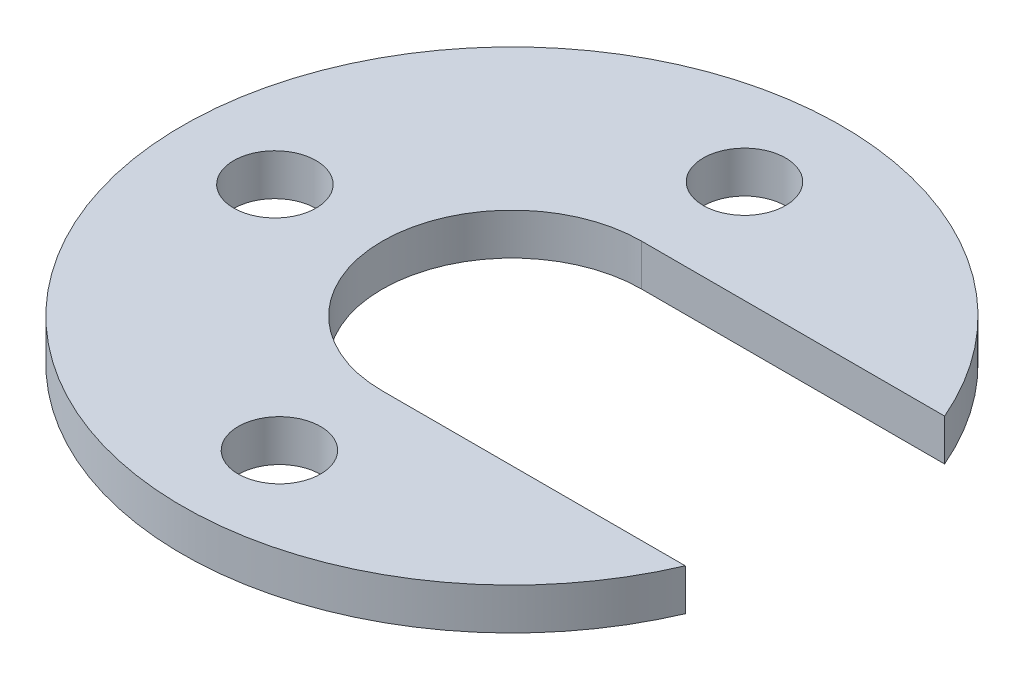
ISO-10303-21;
HEADER;
FILE_DESCRIPTION(('STEP AP214'),'2;1');
FILE_NAME('part.step','',(''),(''),'','','');
FILE_SCHEMA(('AUTOMOTIVE_DESIGN { 1 0 10303 214 1 1 1 1 }'));
ENDSEC;
DATA;
#1=APPLICATION_CONTEXT('core data for automotive mechanical design processes');
#2=APPLICATION_PROTOCOL_DEFINITION('international standard','automotive_design',2000,#1);
#3=PRODUCT_CONTEXT('',#1,'mechanical');
#4=PRODUCT('Part','Part','',(#3));
#5=PRODUCT_RELATED_PRODUCT_CATEGORY('part','',(#4));
#6=PRODUCT_DEFINITION_FORMATION('','',#4);
#7=PRODUCT_DEFINITION_CONTEXT('part definition',#1,'design');
#8=PRODUCT_DEFINITION('design','',#6,#7);
#9=PRODUCT_DEFINITION_SHAPE('','',#8);
#10=(LENGTH_UNIT() NAMED_UNIT(*) SI_UNIT(.MILLI.,.METRE.));
#11=(NAMED_UNIT(*) PLANE_ANGLE_UNIT() SI_UNIT($,.RADIAN.));
#12=(NAMED_UNIT(*) SI_UNIT($,.STERADIAN.) SOLID_ANGLE_UNIT());
#13=UNCERTAINTY_MEASURE_WITH_UNIT(LENGTH_MEASURE(1.E-05),#10,'distance_accuracy_value','');
#14=(GEOMETRIC_REPRESENTATION_CONTEXT(3) GLOBAL_UNCERTAINTY_ASSIGNED_CONTEXT((#13)) GLOBAL_UNIT_ASSIGNED_CONTEXT((#10,
#11,#12)) REPRESENTATION_CONTEXT('',''));
#15=CARTESIAN_POINT('',(0.,0.,0.));
#16=DIRECTION('',(0.,0.,1.));
#17=DIRECTION('',(1.,0.,0.));
#18=AXIS2_PLACEMENT_3D('',#15,#16,#17);
#19=CARTESIAN_POINT('',(0.,5.,0.));
#20=DIRECTION('',(0.,-1.,0.));
#21=DIRECTION('',(0.,0.,-1.));
#22=AXIS2_PLACEMENT_3D('',#19,#20,#21);
#23=CYLINDRICAL_SURFACE('',#22,15.612956290824);
#24=CARTESIAN_POINT('',(0.,0.,0.));
#25=DIRECTION('',(0.,1.,0.));
#26=DIRECTION('',(0.,0.,1.));
#27=AXIS2_PLACEMENT_3D('',#24,#25,#26);
#28=CIRCLE('',#27,15.612956290824);
#29=CARTESIAN_POINT('',(0.,0.,-15.612956290824));
#30=VERTEX_POINT('',#29);
#31=CARTESIAN_POINT('',(0.,0.,15.612956290824));
#32=VERTEX_POINT('',#31);
#33=EDGE_CURVE('E106',#30,#32,#28,.T.);
#34=ORIENTED_EDGE('',*,*,#33,.F.);
#35=DIRECTION('',(0.,-1.,0.));
#36=VECTOR('',#35,1.);
#37=CARTESIAN_POINT('',(0.,5.,-15.612956290824));
#38=LINE('',#37,#36);
#39=CARTESIAN_POINT('',(0.,5.,-15.612956290824));
#40=VERTEX_POINT('',#39);
#41=EDGE_CURVE('E11',#40,#30,#38,.T.);
#42=ORIENTED_EDGE('',*,*,#41,.F.);
#43=CARTESIAN_POINT('',(0.,5.,0.));
#44=DIRECTION('',(0.,1.,0.));
#45=DIRECTION('',(0.,0.,1.));
#46=AXIS2_PLACEMENT_3D('',#43,#44,#45);
#47=CIRCLE('',#46,15.612956290824);
#48=CARTESIAN_POINT('',(0.,5.,15.612956290824));
#49=VERTEX_POINT('',#48);
#50=EDGE_CURVE('E90',#40,#49,#47,.T.);
#51=ORIENTED_EDGE('',*,*,#50,.T.);
#52=DIRECTION('',(0.,-1.,0.));
#53=VECTOR('',#52,1.);
#54=CARTESIAN_POINT('',(0.,5.,15.612956290824));
#55=LINE('',#54,#53);
#56=EDGE_CURVE('E52',#49,#32,#55,.T.);
#57=ORIENTED_EDGE('',*,*,#56,.T.);
#58=EDGE_LOOP('',(#34,#42,#51,#57));
#59=FACE_BOUND('',#58,.T.);
#60=ADVANCED_FACE('F35',(#59),#23,.F.);
#61=CARTESIAN_POINT('',(0.,5.,-15.612956290824));
#62=DIRECTION('',(0.,0.,-1.));
#63=DIRECTION('',(-1.,0.,0.));
#64=AXIS2_PLACEMENT_3D('',#61,#62,#63);
#65=PLANE('',#64);
#66=DIRECTION('',(1.,0.,0.));
#67=VECTOR('',#66,1.);
#68=CARTESIAN_POINT('',(0.,0.,-15.612956290824));
#69=LINE('',#68,#67);
#70=CARTESIAN_POINT('',(36.4861443549786,0.,-15.612956290824));
#71=VERTEX_POINT('',#70);
#72=EDGE_CURVE('E95',#30,#71,#69,.T.);
#73=ORIENTED_EDGE('',*,*,#72,.T.);
#74=DIRECTION('',(0.,-1.,0.));
#75=VECTOR('',#74,1.);
#76=CARTESIAN_POINT('',(36.4861443549786,5.,-15.612956290824));
#77=LINE('',#76,#75);
#78=CARTESIAN_POINT('',(36.4861443549786,5.,-15.612956290824));
#79=VERTEX_POINT('',#78);
#80=EDGE_CURVE('E44',#79,#71,#77,.T.);
#81=ORIENTED_EDGE('',*,*,#80,.F.);
#82=DIRECTION('',(1.,0.,0.));
#83=VECTOR('',#82,1.);
#84=CARTESIAN_POINT('',(0.,5.,-15.612956290824));
#85=LINE('',#84,#83);
#86=EDGE_CURVE('E86',#40,#79,#85,.T.);
#87=ORIENTED_EDGE('',*,*,#86,.F.);
#88=ORIENTED_EDGE('',*,*,#41,.T.);
#89=EDGE_LOOP('',(#73,#81,#87,#88));
#90=FACE_BOUND('',#89,.T.);
#91=ADVANCED_FACE('F93',(#90),#65,.F.);
#92=CARTESIAN_POINT('',(0.,5.,0.));
#93=DIRECTION('',(0.,-1.,0.));
#94=DIRECTION('',(0.,0.,-1.));
#95=AXIS2_PLACEMENT_3D('',#92,#93,#94);
#96=CYLINDRICAL_SURFACE('',#95,39.6863091510349);
#97=CARTESIAN_POINT('',(0.,0.,0.));
#98=DIRECTION('',(0.,1.,0.));
#99=DIRECTION('',(0.,0.,1.));
#100=AXIS2_PLACEMENT_3D('',#97,#98,#99);
#101=CIRCLE('',#100,39.6863091510349);
#102=CARTESIAN_POINT('',(36.4861443549786,0.,15.612956290824));
#103=VERTEX_POINT('',#102);
#104=EDGE_CURVE('E103',#71,#103,#101,.T.);
#105=ORIENTED_EDGE('',*,*,#104,.T.);
#106=DIRECTION('',(0.,-1.,0.));
#107=VECTOR('',#106,1.);
#108=CARTESIAN_POINT('',(36.4861443549786,5.,15.612956290824));
#109=LINE('',#108,#107);
#110=CARTESIAN_POINT('',(36.4861443549786,5.,15.612956290824));
#111=VERTEX_POINT('',#110);
#112=EDGE_CURVE('E66',#111,#103,#109,.T.);
#113=ORIENTED_EDGE('',*,*,#112,.F.);
#114=CARTESIAN_POINT('',(0.,5.,0.));
#115=DIRECTION('',(0.,1.,0.));
#116=DIRECTION('',(0.,0.,1.));
#117=AXIS2_PLACEMENT_3D('',#114,#115,#116);
#118=CIRCLE('',#117,39.6863091510349);
#119=EDGE_CURVE('E78',#79,#111,#118,.T.);
#120=ORIENTED_EDGE('',*,*,#119,.F.);
#121=ORIENTED_EDGE('',*,*,#80,.T.);
#122=EDGE_LOOP('',(#105,#113,#120,#121));
#123=FACE_BOUND('',#122,.T.);
#124=ADVANCED_FACE('F80',(#123),#96,.T.);
#125=CARTESIAN_POINT('',(-28.,5.,0.544306250715498));
#126=DIRECTION('',(0.,-1.,0.));
#127=DIRECTION('',(0.,0.,-1.));
#128=AXIS2_PLACEMENT_3D('',#125,#126,#127);
#129=CYLINDRICAL_SURFACE('',#128,4.96078864387936);
#130=CARTESIAN_POINT('',(-28.,5.,0.544306250715498));
#131=DIRECTION('',(0.,1.,0.));
#132=DIRECTION('',(0.,0.,1.));
#133=AXIS2_PLACEMENT_3D('',#130,#131,#132);
#134=CIRCLE('',#133,4.96078864387936);
#135=CARTESIAN_POINT('',(-28.,5.,5.50509489459486));
#136=VERTEX_POINT('',#135);
#137=EDGE_CURVE('E119',#136,#136,#134,.T.);
#138=ORIENTED_EDGE('',*,*,#137,.T.);
#139=EDGE_LOOP('',(#138));
#140=FACE_BOUND('',#139,.T.);
#141=CARTESIAN_POINT('',(-28.,0.,0.544306250715498));
#142=DIRECTION('',(0.,1.,0.));
#143=DIRECTION('',(0.,0.,1.));
#144=AXIS2_PLACEMENT_3D('',#141,#142,#143);
#145=CIRCLE('',#144,4.96078864387936);
#146=CARTESIAN_POINT('',(-28.,0.,5.50509489459486));
#147=VERTEX_POINT('',#146);
#148=EDGE_CURVE('E108',#147,#147,#145,.T.);
#149=ORIENTED_EDGE('',*,*,#148,.F.);
#150=EDGE_LOOP('',(#149));
#151=FACE_BOUND('',#150,.T.);
#152=ADVANCED_FACE('F139',(#140,#151),#129,.F.);
#153=CARTESIAN_POINT('',(0.,5.,-28.));
#154=DIRECTION('',(0.,-1.,0.));
#155=DIRECTION('',(0.,0.,-1.));
#156=AXIS2_PLACEMENT_3D('',#153,#154,#155);
#157=CYLINDRICAL_SURFACE('',#156,4.96078864387936);
#158=CARTESIAN_POINT('',(0.,5.,-28.));
#159=DIRECTION('',(0.,1.,0.));
#160=DIRECTION('',(0.,0.,1.));
#161=AXIS2_PLACEMENT_3D('',#158,#159,#160);
#162=CIRCLE('',#161,4.96078864387936);
#163=CARTESIAN_POINT('',(0.,5.,-23.0392113561206));
#164=VERTEX_POINT('',#163);
#165=EDGE_CURVE('E122',#164,#164,#162,.T.);
#166=ORIENTED_EDGE('',*,*,#165,.T.);
#167=EDGE_LOOP('',(#166));
#168=FACE_BOUND('',#167,.T.);
#169=CARTESIAN_POINT('',(0.,0.,-28.));
#170=DIRECTION('',(0.,1.,0.));
#171=DIRECTION('',(0.,0.,1.));
#172=AXIS2_PLACEMENT_3D('',#169,#170,#171);
#173=CIRCLE('',#172,4.96078864387936);
#174=CARTESIAN_POINT('',(0.,0.,-23.0392113561206));
#175=VERTEX_POINT('',#174);
#176=EDGE_CURVE('E111',#175,#175,#173,.T.);
#177=ORIENTED_EDGE('',*,*,#176,.F.);
#178=EDGE_LOOP('',(#177));
#179=FACE_BOUND('',#178,.T.);
#180=ADVANCED_FACE('F142',(#168,#179),#157,.F.);
#181=CARTESIAN_POINT('',(0.,5.,28.));
#182=DIRECTION('',(0.,-1.,0.));
#183=DIRECTION('',(0.,0.,-1.));
#184=AXIS2_PLACEMENT_3D('',#181,#182,#183);
#185=CYLINDRICAL_SURFACE('',#184,4.96078864387936);
#186=CARTESIAN_POINT('',(0.,5.,28.));
#187=DIRECTION('',(0.,1.,0.));
#188=DIRECTION('',(0.,0.,1.));
#189=AXIS2_PLACEMENT_3D('',#186,#187,#188);
#190=CIRCLE('',#189,4.96078864387936);
#191=CARTESIAN_POINT('',(0.,5.,32.9607886438794));
#192=VERTEX_POINT('',#191);
#193=EDGE_CURVE('E102',#192,#192,#190,.T.);
#194=ORIENTED_EDGE('',*,*,#193,.T.);
#195=EDGE_LOOP('',(#194));
#196=FACE_BOUND('',#195,.T.);
#197=CARTESIAN_POINT('',(0.,0.,28.));
#198=DIRECTION('',(0.,1.,0.));
#199=DIRECTION('',(0.,0.,1.));
#200=AXIS2_PLACEMENT_3D('',#197,#198,#199);
#201=CIRCLE('',#200,4.96078864387936);
#202=CARTESIAN_POINT('',(0.,0.,32.9607886438794));
#203=VERTEX_POINT('',#202);
#204=EDGE_CURVE('E114',#203,#203,#201,.T.);
#205=ORIENTED_EDGE('',*,*,#204,.F.);
#206=EDGE_LOOP('',(#205));
#207=FACE_BOUND('',#206,.T.);
#208=ADVANCED_FACE('F37',(#196,#207),#185,.F.);
#209=CARTESIAN_POINT('',(0.,5.,15.612956290824));
#210=DIRECTION('',(0.,0.,-1.));
#211=DIRECTION('',(-1.,0.,0.));
#212=AXIS2_PLACEMENT_3D('',#209,#210,#211);
#213=PLANE('',#212);
#214=DIRECTION('',(1.,0.,0.));
#215=VECTOR('',#214,1.);
#216=CARTESIAN_POINT('',(0.,0.,15.612956290824));
#217=LINE('',#216,#215);
#218=EDGE_CURVE('E99',#32,#103,#217,.T.);
#219=ORIENTED_EDGE('',*,*,#218,.F.);
#220=ORIENTED_EDGE('',*,*,#56,.F.);
#221=DIRECTION('',(1.,0.,0.));
#222=VECTOR('',#221,1.);
#223=CARTESIAN_POINT('',(0.,5.,15.612956290824));
#224=LINE('',#223,#222);
#225=EDGE_CURVE('E85',#49,#111,#224,.T.);
#226=ORIENTED_EDGE('',*,*,#225,.T.);
#227=ORIENTED_EDGE('',*,*,#112,.T.);
#228=EDGE_LOOP('',(#219,#220,#226,#227));
#229=FACE_BOUND('',#228,.T.);
#230=ADVANCED_FACE('F133',(#229),#213,.T.);
#231=CARTESIAN_POINT('',(0.,5.,0.));
#232=DIRECTION('',(0.,1.,0.));
#233=DIRECTION('',(0.,0.,1.));
#234=AXIS2_PLACEMENT_3D('',#231,#232,#233);
#235=PLANE('',#234);
#236=ORIENTED_EDGE('',*,*,#193,.F.);
#237=EDGE_LOOP('',(#236));
#238=FACE_BOUND('',#237,.T.);
#239=ORIENTED_EDGE('',*,*,#165,.F.);
#240=EDGE_LOOP('',(#239));
#241=FACE_BOUND('',#240,.T.);
#242=ORIENTED_EDGE('',*,*,#137,.F.);
#243=EDGE_LOOP('',(#242));
#244=FACE_BOUND('',#243,.T.);
#245=ORIENTED_EDGE('',*,*,#50,.F.);
#246=ORIENTED_EDGE('',*,*,#86,.T.);
#247=ORIENTED_EDGE('',*,*,#119,.T.);
#248=ORIENTED_EDGE('',*,*,#225,.F.);
#249=EDGE_LOOP('',(#245,#246,#247,#248));
#250=FACE_BOUND('',#249,.T.);
#251=ADVANCED_FACE('F89',(#238,#241,#244,#250),#235,.T.);
#252=CARTESIAN_POINT('',(0.,0.,0.));
#253=DIRECTION('',(0.,1.,0.));
#254=DIRECTION('',(0.,0.,1.));
#255=AXIS2_PLACEMENT_3D('',#252,#253,#254);
#256=PLANE('',#255);
#257=ORIENTED_EDGE('',*,*,#204,.T.);
#258=EDGE_LOOP('',(#257));
#259=FACE_BOUND('',#258,.T.);
#260=ORIENTED_EDGE('',*,*,#176,.T.);
#261=EDGE_LOOP('',(#260));
#262=FACE_BOUND('',#261,.T.);
#263=ORIENTED_EDGE('',*,*,#148,.T.);
#264=EDGE_LOOP('',(#263));
#265=FACE_BOUND('',#264,.T.);
#266=ORIENTED_EDGE('',*,*,#33,.T.);
#267=ORIENTED_EDGE('',*,*,#218,.T.);
#268=ORIENTED_EDGE('',*,*,#104,.F.);
#269=ORIENTED_EDGE('',*,*,#72,.F.);
#270=EDGE_LOOP('',(#266,#267,#268,#269));
#271=FACE_BOUND('',#270,.T.);
#272=ADVANCED_FACE('F132',(#259,#262,#265,#271),#256,.F.);
#273=CLOSED_SHELL('',(#60,#91,#124,#152,#180,#208,#230,#251,#272));
#274=MANIFOLD_SOLID_BREP('B2',#273);
#275=ADVANCED_BREP_SHAPE_REPRESENTATION('',(#18,#274),#14);
#276=SHAPE_DEFINITION_REPRESENTATION(#9,#275);
ENDSEC;
END-ISO-10303-21;
